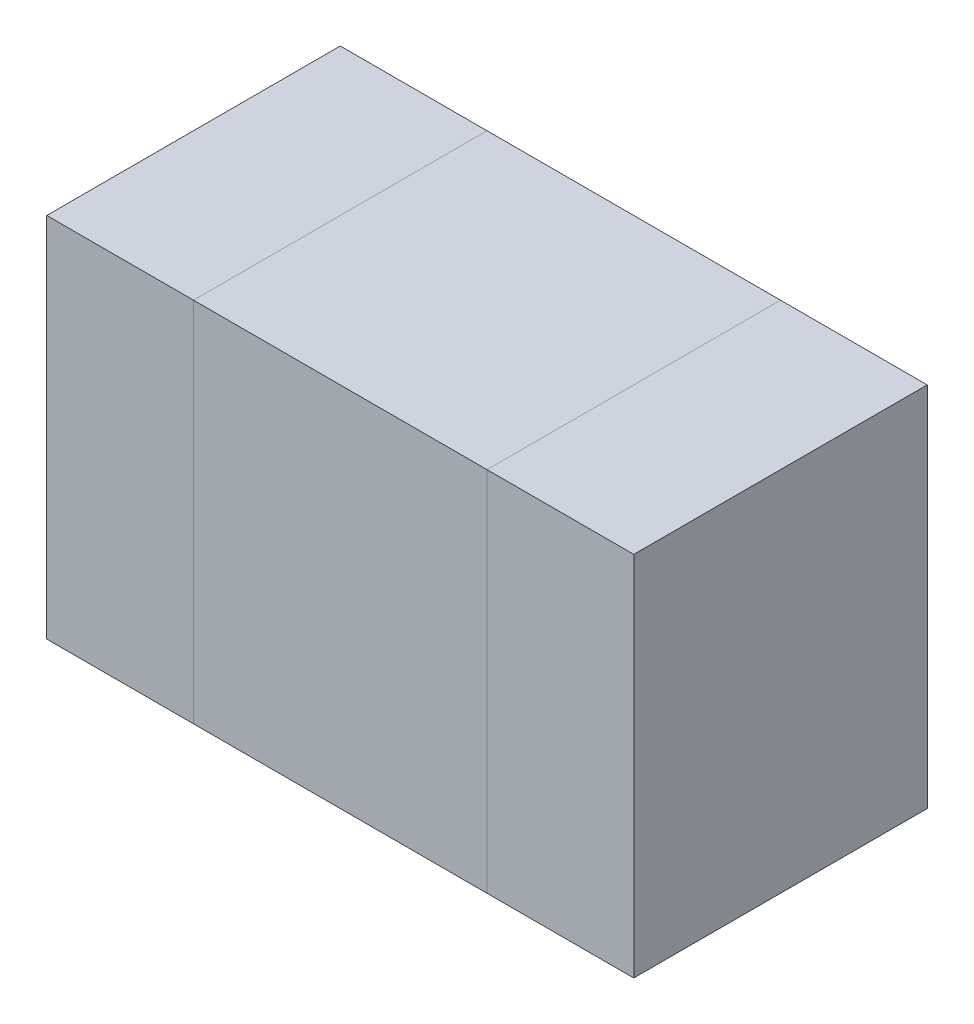
ISO-10303-21;
HEADER;
FILE_DESCRIPTION(('STEP AP214'),'2;1');
FILE_NAME('part.step','',(''),(''),'','','');
FILE_SCHEMA(('AUTOMOTIVE_DESIGN { 1 0 10303 214 1 1 1 1 }'));
ENDSEC;
DATA;
#1=APPLICATION_CONTEXT('core data for automotive mechanical design processes');
#2=APPLICATION_PROTOCOL_DEFINITION('international standard','automotive_design',2000,#1);
#3=PRODUCT_CONTEXT('',#1,'mechanical');
#4=PRODUCT('Part','Part','',(#3));
#5=PRODUCT_RELATED_PRODUCT_CATEGORY('part','',(#4));
#6=PRODUCT_DEFINITION_FORMATION('','',#4);
#7=PRODUCT_DEFINITION_CONTEXT('part definition',#1,'design');
#8=PRODUCT_DEFINITION('design','',#6,#7);
#9=PRODUCT_DEFINITION_SHAPE('','',#8);
#10=(LENGTH_UNIT() NAMED_UNIT(*) SI_UNIT(.MILLI.,.METRE.));
#11=(NAMED_UNIT(*) PLANE_ANGLE_UNIT() SI_UNIT($,.RADIAN.));
#12=(NAMED_UNIT(*) SI_UNIT($,.STERADIAN.) SOLID_ANGLE_UNIT());
#13=UNCERTAINTY_MEASURE_WITH_UNIT(LENGTH_MEASURE(1.E-05),#10,'distance_accuracy_value','');
#14=(GEOMETRIC_REPRESENTATION_CONTEXT(3) GLOBAL_UNCERTAINTY_ASSIGNED_CONTEXT((#13)) GLOBAL_UNIT_ASSIGNED_CONTEXT((#10,
#11,#12)) REPRESENTATION_CONTEXT('',''));
#15=CARTESIAN_POINT('',(0.,0.,0.));
#16=DIRECTION('',(0.,0.,1.));
#17=DIRECTION('',(1.,0.,0.));
#18=AXIS2_PLACEMENT_3D('',#15,#16,#17);
#19=CARTESIAN_POINT('',(-0.49991872,0.54888128,1.01999896));
#20=DIRECTION('',(1.,0.,0.));
#21=DIRECTION('',(0.,0.,-1.));
#22=AXIS2_PLACEMENT_3D('',#19,#20,#21);
#23=PLANE('',#22);
#24=DIRECTION('',(0.,-1.,0.));
#25=VECTOR('',#24,1.);
#26=CARTESIAN_POINT('',(-0.49991872,0.54888128,0.01999896));
#27=LINE('',#26,#25);
#28=CARTESIAN_POINT('',(-0.49991872,0.54888128,0.01999896));
#29=VERTEX_POINT('',#28);
#30=CARTESIAN_POINT('',(-0.49991872,-0.70111872,0.01999896));
#31=VERTEX_POINT('',#30);
#32=EDGE_CURVE('P0_E11',#29,#31,#27,.T.);
#33=ORIENTED_EDGE('',*,*,#32,.T.);
#34=DIRECTION('',(0.,0.,-1.));
#35=VECTOR('',#34,1.);
#36=CARTESIAN_POINT('',(-0.49991872,-0.70111872,1.01999896));
#37=LINE('',#36,#35);
#38=CARTESIAN_POINT('',(-0.49991872,-0.70111872,1.01999896));
#39=VERTEX_POINT('',#38);
#40=EDGE_CURVE('P0_E24',#39,#31,#37,.T.);
#41=ORIENTED_EDGE('',*,*,#40,.F.);
#42=DIRECTION('',(0.,-1.,0.));
#43=VECTOR('',#42,1.);
#44=CARTESIAN_POINT('',(-0.49991872,0.54888128,1.01999896));
#45=LINE('',#44,#43);
#46=CARTESIAN_POINT('',(-0.49991872,0.54888128,1.01999896));
#47=VERTEX_POINT('',#46);
#48=EDGE_CURVE('P0_E88',#47,#39,#45,.T.);
#49=ORIENTED_EDGE('',*,*,#48,.F.);
#50=DIRECTION('',(0.,0.,-1.));
#51=VECTOR('',#50,1.);
#52=CARTESIAN_POINT('',(-0.49991872,0.54888128,1.01999896));
#53=LINE('',#52,#51);
#54=EDGE_CURVE('P0_E73',#47,#29,#53,.T.);
#55=ORIENTED_EDGE('',*,*,#54,.T.);
#56=EDGE_LOOP('',(#33,#41,#49,#55));
#57=FACE_BOUND('',#56,.T.);
#58=ADVANCED_FACE('P0_F17',(#57),#23,.F.);
#59=CARTESIAN_POINT('',(-0.49991872,-0.70111872,1.01999896));
#60=DIRECTION('',(0.,1.,0.));
#61=DIRECTION('',(-1.,0.,0.));
#62=AXIS2_PLACEMENT_3D('',#59,#60,#61);
#63=PLANE('',#62);
#64=DIRECTION('',(1.,0.,0.));
#65=VECTOR('',#64,1.);
#66=CARTESIAN_POINT('',(-0.49991872,-0.70111872,0.01999896));
#67=LINE('',#66,#65);
#68=CARTESIAN_POINT('',(0.50008128,-0.70111872,0.01999896));
#69=VERTEX_POINT('',#68);
#70=EDGE_CURVE('P0_E85',#31,#69,#67,.T.);
#71=ORIENTED_EDGE('',*,*,#70,.T.);
#72=DIRECTION('',(0.,0.,-1.));
#73=VECTOR('',#72,1.);
#74=CARTESIAN_POINT('',(0.50008128,-0.70111872,1.01999896));
#75=LINE('',#74,#73);
#76=CARTESIAN_POINT('',(0.50008128,-0.70111872,1.01999896));
#77=VERTEX_POINT('',#76);
#78=EDGE_CURVE('P0_E83',#77,#69,#75,.T.);
#79=ORIENTED_EDGE('',*,*,#78,.F.);
#80=DIRECTION('',(1.,0.,0.));
#81=VECTOR('',#80,1.);
#82=CARTESIAN_POINT('',(-0.49991872,-0.70111872,1.01999896));
#83=LINE('',#82,#81);
#84=EDGE_CURVE('P0_E60',#39,#77,#83,.T.);
#85=ORIENTED_EDGE('',*,*,#84,.F.);
#86=ORIENTED_EDGE('',*,*,#40,.T.);
#87=EDGE_LOOP('',(#71,#79,#85,#86));
#88=FACE_BOUND('',#87,.T.);
#89=ADVANCED_FACE('P0_F90',(#88),#63,.F.);
#90=CARTESIAN_POINT('',(0.50008128,-0.70111872,1.01999896));
#91=DIRECTION('',(-1.,0.,0.));
#92=DIRECTION('',(0.,-1.,0.));
#93=AXIS2_PLACEMENT_3D('',#90,#91,#92);
#94=PLANE('',#93);
#95=DIRECTION('',(0.,1.,0.));
#96=VECTOR('',#95,1.);
#97=CARTESIAN_POINT('',(0.50008128,-0.70111872,0.01999896));
#98=LINE('',#97,#96);
#99=CARTESIAN_POINT('',(0.50008128,0.54888128,0.01999896));
#100=VERTEX_POINT('',#99);
#101=EDGE_CURVE('P0_E77',#69,#100,#98,.T.);
#102=ORIENTED_EDGE('',*,*,#101,.T.);
#103=DIRECTION('',(0.,0.,-1.));
#104=VECTOR('',#103,1.);
#105=CARTESIAN_POINT('',(0.50008128,0.54888128,1.01999896));
#106=LINE('',#105,#104);
#107=CARTESIAN_POINT('',(0.50008128,0.54888128,1.01999896));
#108=VERTEX_POINT('',#107);
#109=EDGE_CURVE('P0_E65',#108,#100,#106,.T.);
#110=ORIENTED_EDGE('',*,*,#109,.F.);
#111=DIRECTION('',(0.,1.,0.));
#112=VECTOR('',#111,1.);
#113=CARTESIAN_POINT('',(0.50008128,-0.70111872,1.01999896));
#114=LINE('',#113,#112);
#115=EDGE_CURVE('P0_E54',#77,#108,#114,.T.);
#116=ORIENTED_EDGE('',*,*,#115,.F.);
#117=ORIENTED_EDGE('',*,*,#78,.T.);
#118=EDGE_LOOP('',(#102,#110,#116,#117));
#119=FACE_BOUND('',#118,.T.);
#120=ADVANCED_FACE('P0_F75',(#119),#94,.F.);
#121=CARTESIAN_POINT('',(0.50008128,0.54888128,1.01999896));
#122=DIRECTION('',(0.,-1.,0.));
#123=DIRECTION('',(1.,0.,0.));
#124=AXIS2_PLACEMENT_3D('',#121,#122,#123);
#125=PLANE('',#124);
#126=DIRECTION('',(-1.,0.,0.));
#127=VECTOR('',#126,1.);
#128=CARTESIAN_POINT('',(0.50008128,0.54888128,0.01999896));
#129=LINE('',#128,#127);
#130=EDGE_CURVE('P0_E66',#100,#29,#129,.T.);
#131=ORIENTED_EDGE('',*,*,#130,.T.);
#132=ORIENTED_EDGE('',*,*,#54,.F.);
#133=DIRECTION('',(-1.,0.,0.));
#134=VECTOR('',#133,1.);
#135=CARTESIAN_POINT('',(0.50008128,0.54888128,1.01999896));
#136=LINE('',#135,#134);
#137=EDGE_CURVE('P0_E58',#108,#47,#136,.T.);
#138=ORIENTED_EDGE('',*,*,#137,.F.);
#139=ORIENTED_EDGE('',*,*,#109,.T.);
#140=EDGE_LOOP('',(#131,#132,#138,#139));
#141=FACE_BOUND('',#140,.T.);
#142=ADVANCED_FACE('P0_F72',(#141),#125,.F.);
#143=CARTESIAN_POINT('',(8.128E-05,-0.07611872,0.01999896));
#144=DIRECTION('',(0.,0.,1.));
#145=DIRECTION('',(0.,1.,0.));
#146=AXIS2_PLACEMENT_3D('',#143,#144,#145);
#147=PLANE('',#146);
#148=ORIENTED_EDGE('',*,*,#32,.F.);
#149=ORIENTED_EDGE('',*,*,#130,.F.);
#150=ORIENTED_EDGE('',*,*,#101,.F.);
#151=ORIENTED_EDGE('',*,*,#70,.F.);
#152=EDGE_LOOP('',(#148,#149,#150,#151));
#153=FACE_BOUND('',#152,.T.);
#154=ADVANCED_FACE('P0_F91',(#153),#147,.F.);
#155=CARTESIAN_POINT('',(8.128E-05,-0.07611872,1.01999896));
#156=DIRECTION('',(0.,0.,1.));
#157=DIRECTION('',(0.,1.,0.));
#158=AXIS2_PLACEMENT_3D('',#155,#156,#157);
#159=PLANE('',#158);
#160=ORIENTED_EDGE('',*,*,#48,.T.);
#161=ORIENTED_EDGE('',*,*,#84,.T.);
#162=ORIENTED_EDGE('',*,*,#115,.T.);
#163=ORIENTED_EDGE('',*,*,#137,.T.);
#164=EDGE_LOOP('',(#160,#161,#162,#163));
#165=FACE_BOUND('',#164,.T.);
#166=ADVANCED_FACE('P0_F57',(#165),#159,.T.);
#167=CLOSED_SHELL('',(#58,#89,#120,#142,#154,#166));
#168=MANIFOLD_SOLID_BREP('P0_B1',#167);
#169=CARTESIAN_POINT('',(1.00008128,-0.701118719999988,1.01999896));
#170=DIRECTION('',(0.,1.,0.));
#171=DIRECTION('',(0.,0.,-1.));
#172=AXIS2_PLACEMENT_3D('',#169,#170,#171);
#173=PLANE('',#172);
#174=DIRECTION('',(0.,0.,-1.));
#175=VECTOR('',#174,1.);
#176=CARTESIAN_POINT('',(0.50008128,-0.701118719999988,1.01999896));
#177=LINE('',#176,#175);
#178=CARTESIAN_POINT('',(0.50008128,-0.701118719999988,1.01999896));
#179=VERTEX_POINT('',#178);
#180=CARTESIAN_POINT('',(0.50008128,-0.701118719999988,0.0199989600000013));
#181=VERTEX_POINT('',#180);
#182=EDGE_CURVE('P1_E11',#179,#181,#177,.T.);
#183=ORIENTED_EDGE('',*,*,#182,.T.);
#184=DIRECTION('',(-1.,0.,0.));
#185=VECTOR('',#184,1.);
#186=CARTESIAN_POINT('',(1.00008128,-0.701118719999988,0.0199989600000013));
#187=LINE('',#186,#185);
#188=CARTESIAN_POINT('',(1.00008128,-0.701118719999988,0.0199989600000013));
#189=VERTEX_POINT('',#188);
#190=EDGE_CURVE('P1_E24',#189,#181,#187,.T.);
#191=ORIENTED_EDGE('',*,*,#190,.F.);
#192=DIRECTION('',(0.,0.,-1.));
#193=VECTOR('',#192,1.);
#194=CARTESIAN_POINT('',(1.00008128,-0.701118719999988,1.01999896));
#195=LINE('',#194,#193);
#196=CARTESIAN_POINT('',(1.00008128,-0.701118719999988,1.01999896));
#197=VERTEX_POINT('',#196);
#198=EDGE_CURVE('P1_E88',#197,#189,#195,.T.);
#199=ORIENTED_EDGE('',*,*,#198,.F.);
#200=DIRECTION('',(-1.,0.,0.));
#201=VECTOR('',#200,1.);
#202=CARTESIAN_POINT('',(1.00008128,-0.701118719999988,1.01999896));
#203=LINE('',#202,#201);
#204=EDGE_CURVE('P1_E76',#197,#179,#203,.T.);
#205=ORIENTED_EDGE('',*,*,#204,.T.);
#206=EDGE_LOOP('',(#183,#191,#199,#205));
#207=FACE_BOUND('',#206,.T.);
#208=ADVANCED_FACE('P1_F17',(#207),#173,.F.);
#209=CARTESIAN_POINT('',(1.00008128,-0.701118719999988,0.0199989600000013));
#210=DIRECTION('',(0.,0.,1.));
#211=DIRECTION('',(0.,1.,0.));
#212=AXIS2_PLACEMENT_3D('',#209,#210,#211);
#213=PLANE('',#212);
#214=DIRECTION('',(0.,1.,0.));
#215=VECTOR('',#214,1.);
#216=CARTESIAN_POINT('',(0.50008128,-0.701118719999988,0.0199989600000013));
#217=LINE('',#216,#215);
#218=CARTESIAN_POINT('',(0.50008128,0.548881280000012,0.0199989600000013));
#219=VERTEX_POINT('',#218);
#220=EDGE_CURVE('P1_E84',#181,#219,#217,.T.);
#221=ORIENTED_EDGE('',*,*,#220,.T.);
#222=DIRECTION('',(-1.,0.,0.));
#223=VECTOR('',#222,1.);
#224=CARTESIAN_POINT('',(1.00008128,0.548881280000012,0.0199989600000013));
#225=LINE('',#224,#223);
#226=CARTESIAN_POINT('',(1.00008128,0.548881280000012,0.0199989600000013));
#227=VERTEX_POINT('',#226);
#228=EDGE_CURVE('P1_E82',#227,#219,#225,.T.);
#229=ORIENTED_EDGE('',*,*,#228,.F.);
#230=DIRECTION('',(0.,1.,0.));
#231=VECTOR('',#230,1.);
#232=CARTESIAN_POINT('',(1.00008128,-0.701118719999988,0.0199989600000013));
#233=LINE('',#232,#231);
#234=EDGE_CURVE('P1_E61',#189,#227,#233,.T.);
#235=ORIENTED_EDGE('',*,*,#234,.F.);
#236=ORIENTED_EDGE('',*,*,#190,.T.);
#237=EDGE_LOOP('',(#221,#229,#235,#236));
#238=FACE_BOUND('',#237,.T.);
#239=ADVANCED_FACE('P1_F90',(#238),#213,.F.);
#240=CARTESIAN_POINT('',(1.00008128,0.548881280000012,0.0199989600000013));
#241=DIRECTION('',(0.,-1.,0.));
#242=DIRECTION('',(0.,0.,1.));
#243=AXIS2_PLACEMENT_3D('',#240,#241,#242);
#244=PLANE('',#243);
#245=DIRECTION('',(0.,0.,1.));
#246=VECTOR('',#245,1.);
#247=CARTESIAN_POINT('',(0.50008128,0.548881280000012,0.0199989600000013));
#248=LINE('',#247,#246);
#249=CARTESIAN_POINT('',(0.50008128,0.548881280000012,1.01999896));
#250=VERTEX_POINT('',#249);
#251=EDGE_CURVE('P1_E70',#219,#250,#248,.T.);
#252=ORIENTED_EDGE('',*,*,#251,.T.);
#253=DIRECTION('',(-1.,0.,0.));
#254=VECTOR('',#253,1.);
#255=CARTESIAN_POINT('',(1.00008128,0.548881280000012,1.01999896));
#256=LINE('',#255,#254);
#257=CARTESIAN_POINT('',(1.00008128,0.548881280000012,1.01999896));
#258=VERTEX_POINT('',#257);
#259=EDGE_CURVE('P1_E65',#258,#250,#256,.T.);
#260=ORIENTED_EDGE('',*,*,#259,.F.);
#261=DIRECTION('',(0.,0.,1.));
#262=VECTOR('',#261,1.);
#263=CARTESIAN_POINT('',(1.00008128,0.548881280000012,0.0199989600000013));
#264=LINE('',#263,#262);
#265=EDGE_CURVE('P1_E55',#227,#258,#264,.T.);
#266=ORIENTED_EDGE('',*,*,#265,.F.);
#267=ORIENTED_EDGE('',*,*,#228,.T.);
#268=EDGE_LOOP('',(#252,#260,#266,#267));
#269=FACE_BOUND('',#268,.T.);
#270=ADVANCED_FACE('P1_F69',(#269),#244,.F.);
#271=CARTESIAN_POINT('',(1.00008128,0.548881280000012,1.01999896));
#272=DIRECTION('',(0.,0.,-1.));
#273=DIRECTION('',(0.,-1.,0.));
#274=AXIS2_PLACEMENT_3D('',#271,#272,#273);
#275=PLANE('',#274);
#276=DIRECTION('',(0.,-1.,0.));
#277=VECTOR('',#276,1.);
#278=CARTESIAN_POINT('',(0.50008128,0.548881280000012,1.01999896));
#279=LINE('',#278,#277);
#280=EDGE_CURVE('P1_E66',#250,#179,#279,.T.);
#281=ORIENTED_EDGE('',*,*,#280,.T.);
#282=ORIENTED_EDGE('',*,*,#204,.F.);
#283=DIRECTION('',(0.,-1.,0.));
#284=VECTOR('',#283,1.);
#285=CARTESIAN_POINT('',(1.00008128,0.548881280000012,1.01999896));
#286=LINE('',#285,#284);
#287=EDGE_CURVE('P1_E60',#258,#197,#286,.T.);
#288=ORIENTED_EDGE('',*,*,#287,.F.);
#289=ORIENTED_EDGE('',*,*,#259,.T.);
#290=EDGE_LOOP('',(#281,#282,#288,#289));
#291=FACE_BOUND('',#290,.T.);
#292=ADVANCED_FACE('P1_F75',(#291),#275,.F.);
#293=CARTESIAN_POINT('',(0.50008128,-0.0761187199999881,0.519998960000001));
#294=DIRECTION('',(1.,0.,0.));
#295=DIRECTION('',(0.,0.,-1.));
#296=AXIS2_PLACEMENT_3D('',#293,#294,#295);
#297=PLANE('',#296);
#298=ORIENTED_EDGE('',*,*,#182,.F.);
#299=ORIENTED_EDGE('',*,*,#280,.F.);
#300=ORIENTED_EDGE('',*,*,#251,.F.);
#301=ORIENTED_EDGE('',*,*,#220,.F.);
#302=EDGE_LOOP('',(#298,#299,#300,#301));
#303=FACE_BOUND('',#302,.T.);
#304=ADVANCED_FACE('P1_F91',(#303),#297,.F.);
#305=CARTESIAN_POINT('',(1.00008128,-0.0761187199999881,0.519998960000001));
#306=DIRECTION('',(1.,0.,0.));
#307=DIRECTION('',(0.,0.,-1.));
#308=AXIS2_PLACEMENT_3D('',#305,#306,#307);
#309=PLANE('',#308);
#310=ORIENTED_EDGE('',*,*,#198,.T.);
#311=ORIENTED_EDGE('',*,*,#234,.T.);
#312=ORIENTED_EDGE('',*,*,#265,.T.);
#313=ORIENTED_EDGE('',*,*,#287,.T.);
#314=EDGE_LOOP('',(#310,#311,#312,#313));
#315=FACE_BOUND('',#314,.T.);
#316=ADVANCED_FACE('P1_F58',(#315),#309,.T.);
#317=CLOSED_SHELL('',(#208,#239,#270,#292,#304,#316));
#318=MANIFOLD_SOLID_BREP('P1_B1',#317);
#319=CARTESIAN_POINT('',(-0.99991872,-0.70111872,0.0199989600000003));
#320=DIRECTION('',(0.,1.,0.));
#321=DIRECTION('',(0.,0.,1.));
#322=AXIS2_PLACEMENT_3D('',#319,#320,#321);
#323=PLANE('',#322);
#324=DIRECTION('',(0.,0.,1.));
#325=VECTOR('',#324,1.);
#326=CARTESIAN_POINT('',(-0.49991872,-0.70111872,0.0199989600000003));
#327=LINE('',#326,#325);
#328=CARTESIAN_POINT('',(-0.49991872,-0.70111872,0.0199989600000003));
#329=VERTEX_POINT('',#328);
#330=CARTESIAN_POINT('',(-0.49991872,-0.70111872,1.01999896));
#331=VERTEX_POINT('',#330);
#332=EDGE_CURVE('P2_E10',#329,#331,#327,.T.);
#333=ORIENTED_EDGE('',*,*,#332,.T.);
#334=DIRECTION('',(1.,0.,0.));
#335=VECTOR('',#334,1.);
#336=CARTESIAN_POINT('',(-0.99991872,-0.70111872,1.01999896));
#337=LINE('',#336,#335);
#338=CARTESIAN_POINT('',(-0.99991872,-0.70111872,1.01999896));
#339=VERTEX_POINT('',#338);
#340=EDGE_CURVE('P2_E23',#339,#331,#337,.T.);
#341=ORIENTED_EDGE('',*,*,#340,.F.);
#342=DIRECTION('',(0.,0.,1.));
#343=VECTOR('',#342,1.);
#344=CARTESIAN_POINT('',(-0.99991872,-0.70111872,0.0199989600000003));
#345=LINE('',#344,#343);
#346=CARTESIAN_POINT('',(-0.99991872,-0.70111872,0.0199989600000003));
#347=VERTEX_POINT('',#346);
#348=EDGE_CURVE('P2_E87',#347,#339,#345,.T.);
#349=ORIENTED_EDGE('',*,*,#348,.F.);
#350=DIRECTION('',(1.,0.,0.));
#351=VECTOR('',#350,1.);
#352=CARTESIAN_POINT('',(-0.99991872,-0.70111872,0.0199989600000003));
#353=LINE('',#352,#351);
#354=EDGE_CURVE('P2_E76',#347,#329,#353,.T.);
#355=ORIENTED_EDGE('',*,*,#354,.T.);
#356=EDGE_LOOP('',(#333,#341,#349,#355));
#357=FACE_BOUND('',#356,.T.);
#358=ADVANCED_FACE('P2_F16',(#357),#323,.F.);
#359=CARTESIAN_POINT('',(-0.99991872,-0.70111872,1.01999896));
#360=DIRECTION('',(0.,0.,-1.));
#361=DIRECTION('',(0.,1.,0.));
#362=AXIS2_PLACEMENT_3D('',#359,#360,#361);
#363=PLANE('',#362);
#364=DIRECTION('',(0.,1.,0.));
#365=VECTOR('',#364,1.);
#366=CARTESIAN_POINT('',(-0.49991872,-0.70111872,1.01999896));
#367=LINE('',#366,#365);
#368=CARTESIAN_POINT('',(-0.49991872,0.54888128,1.01999896));
#369=VERTEX_POINT('',#368);
#370=EDGE_CURVE('P2_E84',#331,#369,#367,.T.);
#371=ORIENTED_EDGE('',*,*,#370,.T.);
#372=DIRECTION('',(1.,0.,0.));
#373=VECTOR('',#372,1.);
#374=CARTESIAN_POINT('',(-0.99991872,0.54888128,1.01999896));
#375=LINE('',#374,#373);
#376=CARTESIAN_POINT('',(-0.99991872,0.54888128,1.01999896));
#377=VERTEX_POINT('',#376);
#378=EDGE_CURVE('P2_E82',#377,#369,#375,.T.);
#379=ORIENTED_EDGE('',*,*,#378,.F.);
#380=DIRECTION('',(0.,1.,0.));
#381=VECTOR('',#380,1.);
#382=CARTESIAN_POINT('',(-0.99991872,-0.70111872,1.01999896));
#383=LINE('',#382,#381);
#384=EDGE_CURVE('P2_E71',#339,#377,#383,.T.);
#385=ORIENTED_EDGE('',*,*,#384,.F.);
#386=ORIENTED_EDGE('',*,*,#340,.T.);
#387=EDGE_LOOP('',(#371,#379,#385,#386));
#388=FACE_BOUND('',#387,.T.);
#389=ADVANCED_FACE('P2_F89',(#388),#363,.F.);
#390=CARTESIAN_POINT('',(-0.99991872,0.54888128,1.01999896));
#391=DIRECTION('',(0.,-1.,0.));
#392=DIRECTION('',(0.,0.,-1.));
#393=AXIS2_PLACEMENT_3D('',#390,#391,#392);
#394=PLANE('',#393);
#395=DIRECTION('',(0.,0.,-1.));
#396=VECTOR('',#395,1.);
#397=CARTESIAN_POINT('',(-0.49991872,0.54888128,1.01999896));
#398=LINE('',#397,#396);
#399=CARTESIAN_POINT('',(-0.49991872,0.54888128,0.0199989600000002));
#400=VERTEX_POINT('',#399);
#401=EDGE_CURVE('P2_E59',#369,#400,#398,.T.);
#402=ORIENTED_EDGE('',*,*,#401,.T.);
#403=DIRECTION('',(1.,0.,0.));
#404=VECTOR('',#403,1.);
#405=CARTESIAN_POINT('',(-0.99991872,0.54888128,0.0199989600000002));
#406=LINE('',#405,#404);
#407=CARTESIAN_POINT('',(-0.99991872,0.54888128,0.0199989600000002));
#408=VERTEX_POINT('',#407);
#409=EDGE_CURVE('P2_E53',#408,#400,#406,.T.);
#410=ORIENTED_EDGE('',*,*,#409,.F.);
#411=DIRECTION('',(0.,0.,-1.));
#412=VECTOR('',#411,1.);
#413=CARTESIAN_POINT('',(-0.99991872,0.54888128,1.01999896));
#414=LINE('',#413,#412);
#415=EDGE_CURVE('P2_E57',#377,#408,#414,.T.);
#416=ORIENTED_EDGE('',*,*,#415,.F.);
#417=ORIENTED_EDGE('',*,*,#378,.T.);
#418=EDGE_LOOP('',(#402,#410,#416,#417));
#419=FACE_BOUND('',#418,.T.);
#420=ADVANCED_FACE('P2_F55',(#419),#394,.F.);
#421=CARTESIAN_POINT('',(-0.99991872,0.54888128,0.0199989600000002));
#422=DIRECTION('',(0.,0.,1.));
#423=DIRECTION('',(0.,-1.,0.));
#424=AXIS2_PLACEMENT_3D('',#421,#422,#423);
#425=PLANE('',#424);
#426=DIRECTION('',(0.,-1.,0.));
#427=VECTOR('',#426,1.);
#428=CARTESIAN_POINT('',(-0.49991872,0.54888128,0.0199989600000002));
#429=LINE('',#428,#427);
#430=EDGE_CURVE('P2_E72',#400,#329,#429,.T.);
#431=ORIENTED_EDGE('',*,*,#430,.T.);
#432=ORIENTED_EDGE('',*,*,#354,.F.);
#433=DIRECTION('',(0.,-1.,0.));
#434=VECTOR('',#433,1.);
#435=CARTESIAN_POINT('',(-0.99991872,0.54888128,0.0199989600000002));
#436=LINE('',#435,#434);
#437=EDGE_CURVE('P2_E69',#408,#347,#436,.T.);
#438=ORIENTED_EDGE('',*,*,#437,.F.);
#439=ORIENTED_EDGE('',*,*,#409,.T.);
#440=EDGE_LOOP('',(#431,#432,#438,#439));
#441=FACE_BOUND('',#440,.T.);
#442=ADVANCED_FACE('P2_F75',(#441),#425,.F.);
#443=CARTESIAN_POINT('',(-0.49991872,-0.0761187199999999,0.51999896));
#444=DIRECTION('',(-1.,0.,0.));
#445=DIRECTION('',(0.,0.,1.));
#446=AXIS2_PLACEMENT_3D('',#443,#444,#445);
#447=PLANE('',#446);
#448=ORIENTED_EDGE('',*,*,#332,.F.);
#449=ORIENTED_EDGE('',*,*,#430,.F.);
#450=ORIENTED_EDGE('',*,*,#401,.F.);
#451=ORIENTED_EDGE('',*,*,#370,.F.);
#452=EDGE_LOOP('',(#448,#449,#450,#451));
#453=FACE_BOUND('',#452,.T.);
#454=ADVANCED_FACE('P2_F90',(#453),#447,.F.);
#455=CARTESIAN_POINT('',(-0.99991872,-0.0761187199999998,0.51999896));
#456=DIRECTION('',(-1.,0.,0.));
#457=DIRECTION('',(0.,0.,1.));
#458=AXIS2_PLACEMENT_3D('',#455,#456,#457);
#459=PLANE('',#458);
#460=ORIENTED_EDGE('',*,*,#348,.T.);
#461=ORIENTED_EDGE('',*,*,#384,.T.);
#462=ORIENTED_EDGE('',*,*,#415,.T.);
#463=ORIENTED_EDGE('',*,*,#437,.T.);
#464=EDGE_LOOP('',(#460,#461,#462,#463));
#465=FACE_BOUND('',#464,.T.);
#466=ADVANCED_FACE('P2_F68',(#465),#459,.T.);
#467=CLOSED_SHELL('',(#358,#389,#420,#442,#454,#466));
#468=MANIFOLD_SOLID_BREP('P2_B1',#467);
#469=ADVANCED_BREP_SHAPE_REPRESENTATION('',(#18,#168,#318,#468),#14);
#470=SHAPE_DEFINITION_REPRESENTATION(#9,#469);
ENDSEC;
END-ISO-10303-21;
